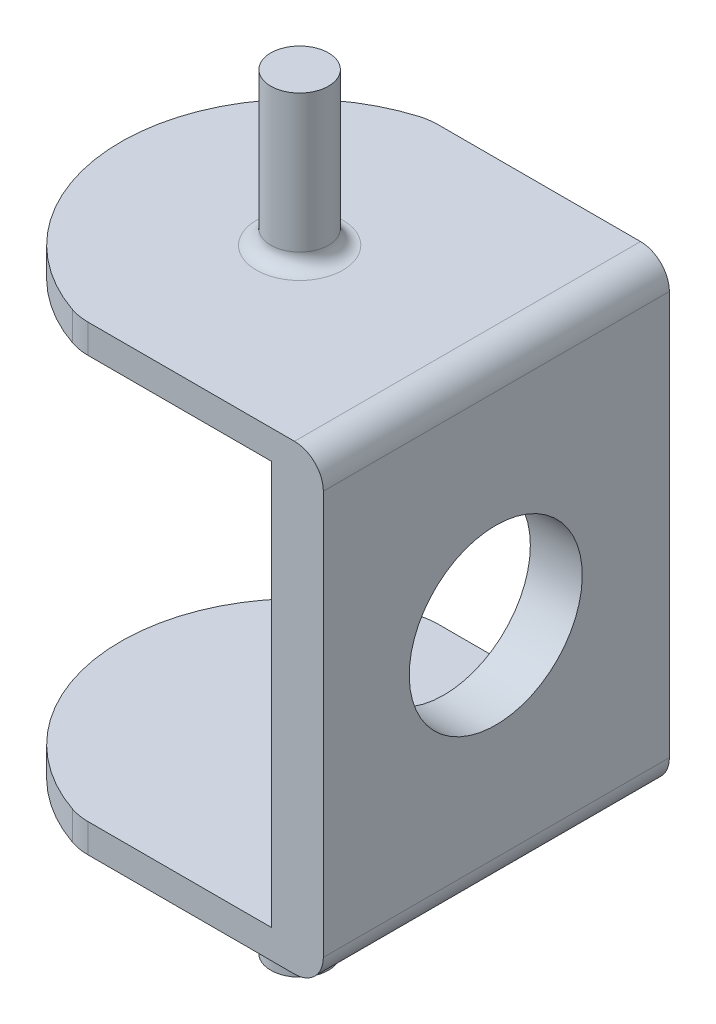
ISO-10303-21;
HEADER;
FILE_DESCRIPTION(('STEP AP214'),'2;1');
FILE_NAME('part.step','',(''),(''),'','','');
FILE_SCHEMA(('AUTOMOTIVE_DESIGN { 1 0 10303 214 1 1 1 1 }'));
ENDSEC;
DATA;
#1=APPLICATION_CONTEXT('core data for automotive mechanical design processes');
#2=APPLICATION_PROTOCOL_DEFINITION('international standard','automotive_design',2000,#1);
#3=PRODUCT_CONTEXT('',#1,'mechanical');
#4=PRODUCT('Part','Part','',(#3));
#5=PRODUCT_RELATED_PRODUCT_CATEGORY('part','',(#4));
#6=PRODUCT_DEFINITION_FORMATION('','',#4);
#7=PRODUCT_DEFINITION_CONTEXT('part definition',#1,'design');
#8=PRODUCT_DEFINITION('design','',#6,#7);
#9=PRODUCT_DEFINITION_SHAPE('','',#8);
#10=(LENGTH_UNIT() NAMED_UNIT(*) SI_UNIT(.MILLI.,.METRE.));
#11=(NAMED_UNIT(*) PLANE_ANGLE_UNIT() SI_UNIT($,.RADIAN.));
#12=(NAMED_UNIT(*) SI_UNIT($,.STERADIAN.) SOLID_ANGLE_UNIT());
#13=UNCERTAINTY_MEASURE_WITH_UNIT(LENGTH_MEASURE(1.E-05),#10,'distance_accuracy_value','');
#14=(GEOMETRIC_REPRESENTATION_CONTEXT(3) GLOBAL_UNCERTAINTY_ASSIGNED_CONTEXT((#13)) GLOBAL_UNIT_ASSIGNED_CONTEXT((#10,
#11,#12)) REPRESENTATION_CONTEXT('',''));
#15=CARTESIAN_POINT('',(0.,0.,0.));
#16=DIRECTION('',(0.,0.,1.));
#17=DIRECTION('',(1.,0.,0.));
#18=AXIS2_PLACEMENT_3D('',#15,#16,#17);
#19=CARTESIAN_POINT('',(60.,70.125,59.7864866616264));
#20=DIRECTION('',(0.,0.,1.));
#21=DIRECTION('',(1.,0.,0.));
#22=AXIS2_PLACEMENT_3D('',#19,#20,#21);
#23=PLANE('',#22);
#24=DIRECTION('',(1.,0.,0.));
#25=VECTOR('',#24,1.);
#26=CARTESIAN_POINT('',(60.,-79.875,59.7864866616264));
#27=LINE('',#26,#25);
#28=CARTESIAN_POINT('',(-13.5908207957896,-79.875,59.7864866616265));
#29=VERTEX_POINT('',#28);
#30=CARTESIAN_POINT('',(58.,-79.875,59.7864866616264));
#31=VERTEX_POINT('',#30);
#32=EDGE_CURVE('E192',#29,#31,#27,.T.);
#33=ORIENTED_EDGE('',*,*,#32,.T.);
#34=CARTESIAN_POINT('',(58.,-69.875,59.7864866616264));
#35=DIRECTION('',(0.,0.,1.));
#36=DIRECTION('',(1.,0.,0.));
#37=AXIS2_PLACEMENT_3D('',#34,#35,#36);
#38=CIRCLE('',#37,10.);
#39=CARTESIAN_POINT('',(68.,-69.875,59.7864866616265));
#40=VERTEX_POINT('',#39);
#41=EDGE_CURVE('E266',#31,#40,#38,.T.);
#42=ORIENTED_EDGE('',*,*,#41,.T.);
#43=DIRECTION('',(0.,1.,0.));
#44=VECTOR('',#43,1.);
#45=CARTESIAN_POINT('',(68.,-79.875,59.7864866616265));
#46=LINE('',#45,#44);
#47=CARTESIAN_POINT('',(68.,70.125,59.7864866616265));
#48=VERTEX_POINT('',#47);
#49=EDGE_CURVE('E172',#40,#48,#46,.T.);
#50=ORIENTED_EDGE('',*,*,#49,.T.);
#51=CARTESIAN_POINT('',(58.,70.125,59.7864866616264));
#52=DIRECTION('',(0.,0.,1.));
#53=DIRECTION('',(1.,0.,0.));
#54=AXIS2_PLACEMENT_3D('',#51,#52,#53);
#55=CIRCLE('',#54,10.);
#56=CARTESIAN_POINT('',(58.,80.125,59.7864866616264));
#57=VERTEX_POINT('',#56);
#58=EDGE_CURVE('E264',#48,#57,#55,.T.);
#59=ORIENTED_EDGE('',*,*,#58,.T.);
#60=DIRECTION('',(1.,0.,0.));
#61=VECTOR('',#60,1.);
#62=CARTESIAN_POINT('',(60.,80.125,59.7864866616264));
#63=LINE('',#62,#61);
#64=CARTESIAN_POINT('',(-13.5908207957896,80.125,59.7864866616265));
#65=VERTEX_POINT('',#64);
#66=EDGE_CURVE('E200',#65,#57,#63,.T.);
#67=ORIENTED_EDGE('',*,*,#66,.F.);
#68=DIRECTION('',(0.,1.,0.));
#69=VECTOR('',#68,1.);
#70=CARTESIAN_POINT('',(-13.5908207957896,70.125,59.7864866616265));
#71=LINE('',#70,#69);
#72=CARTESIAN_POINT('',(-13.5908207957896,70.125,59.7864866616265));
#73=VERTEX_POINT('',#72);
#74=EDGE_CURVE('E157',#65,#73,#71,.F.);
#75=ORIENTED_EDGE('',*,*,#74,.T.);
#76=DIRECTION('',(1.,0.,0.));
#77=VECTOR('',#76,1.);
#78=CARTESIAN_POINT('',(60.,70.125,59.7864866616264));
#79=LINE('',#78,#77);
#80=CARTESIAN_POINT('',(50.,70.125,59.7864866616265));
#81=VERTEX_POINT('',#80);
#82=EDGE_CURVE('E150',#73,#81,#79,.T.);
#83=ORIENTED_EDGE('',*,*,#82,.T.);
#84=DIRECTION('',(0.,-1.,0.));
#85=VECTOR('',#84,1.);
#86=CARTESIAN_POINT('',(50.,70.125,59.7864866616265));
#87=LINE('',#86,#85);
#88=CARTESIAN_POINT('',(50.,-69.875,59.7864866616264));
#89=VERTEX_POINT('',#88);
#90=EDGE_CURVE('E154',#81,#89,#87,.T.);
#91=ORIENTED_EDGE('',*,*,#90,.T.);
#92=DIRECTION('',(1.,0.,0.));
#93=VECTOR('',#92,1.);
#94=CARTESIAN_POINT('',(60.,-69.875,59.7864866616264));
#95=LINE('',#94,#93);
#96=CARTESIAN_POINT('',(-13.5908207957896,-69.875,59.7864866616265));
#97=VERTEX_POINT('',#96);
#98=EDGE_CURVE('E182',#97,#89,#95,.T.);
#99=ORIENTED_EDGE('',*,*,#98,.F.);
#100=DIRECTION('',(0.,1.,0.));
#101=VECTOR('',#100,1.);
#102=CARTESIAN_POINT('',(-13.5908207957896,-79.875,59.7864866616265));
#103=LINE('',#102,#101);
#104=EDGE_CURVE('E258',#97,#29,#103,.F.);
#105=ORIENTED_EDGE('',*,*,#104,.T.);
#106=EDGE_LOOP('',(#33,#42,#50,#59,#67,#75,#83,#91,#99,#105));
#107=FACE_BOUND('',#106,.T.);
#108=ADVANCED_FACE('F48',(#107),#23,.T.);
#109=CARTESIAN_POINT('',(0.,70.125,0.));
#110=DIRECTION('',(0.,1.,0.));
#111=DIRECTION('',(-1.,0.,0.));
#112=AXIS2_PLACEMENT_3D('',#109,#110,#111);
#113=CYLINDRICAL_SURFACE('',#112,62.0437264140448);
#114=CARTESIAN_POINT('',(0.,80.125,0.));
#115=DIRECTION('',(0.,1.,0.));
#116=DIRECTION('',(-1.,0.,0.));
#117=AXIS2_PLACEMENT_3D('',#114,#115,#116);
#118=CIRCLE('',#117,62.0437264140448);
#119=CARTESIAN_POINT('',(-18.106502363727,80.125,-59.3428897130329));
#120=VERTEX_POINT('',#119);
#121=CARTESIAN_POINT('',(-20.0559093856771,80.125,58.7127284841571));
#122=VERTEX_POINT('',#121);
#123=EDGE_CURVE('E204',#120,#122,#118,.T.);
#124=ORIENTED_EDGE('',*,*,#123,.F.);
#125=DIRECTION('',(0.,1.,0.));
#126=VECTOR('',#125,1.);
#127=CARTESIAN_POINT('',(-18.106502363727,70.125,-59.3428897130329));
#128=LINE('',#127,#126);
#129=CARTESIAN_POINT('',(-18.106502363727,70.125,-59.3428897130329));
#130=VERTEX_POINT('',#129);
#131=EDGE_CURVE('E237',#120,#130,#128,.F.);
#132=ORIENTED_EDGE('',*,*,#131,.T.);
#133=CARTESIAN_POINT('',(0.,70.125,0.));
#134=DIRECTION('',(0.,1.,0.));
#135=DIRECTION('',(-1.,0.,0.));
#136=AXIS2_PLACEMENT_3D('',#133,#134,#135);
#137=CIRCLE('',#136,62.0437264140448);
#138=CARTESIAN_POINT('',(-20.0559093856771,70.125,58.7127284841571));
#139=VERTEX_POINT('',#138);
#140=EDGE_CURVE('E162',#130,#139,#137,.T.);
#141=ORIENTED_EDGE('',*,*,#140,.T.);
#142=DIRECTION('',(0.,1.,0.));
#143=VECTOR('',#142,1.);
#144=CARTESIAN_POINT('',(-20.0559093856771,70.125,58.7127284841571));
#145=LINE('',#144,#143);
#146=EDGE_CURVE('E234',#139,#122,#145,.T.);
#147=ORIENTED_EDGE('',*,*,#146,.T.);
#148=EDGE_LOOP('',(#124,#132,#141,#147));
#149=FACE_BOUND('',#148,.T.);
#150=ADVANCED_FACE('F317',(#149),#113,.T.);
#151=CARTESIAN_POINT('',(60.,70.125,-60.2135133383735));
#152=DIRECTION('',(0.,0.,-1.));
#153=DIRECTION('',(-1.,0.,0.));
#154=AXIS2_PLACEMENT_3D('',#151,#152,#153);
#155=PLANE('',#154);
#156=DIRECTION('',(0.,-1.,0.));
#157=VECTOR('',#156,1.);
#158=CARTESIAN_POINT('',(68.,-79.875,-60.2135133383735));
#159=LINE('',#158,#157);
#160=CARTESIAN_POINT('',(68.,70.125,-60.2135133383735));
#161=VERTEX_POINT('',#160);
#162=CARTESIAN_POINT('',(68.,-69.875,-60.2135133383735));
#163=VERTEX_POINT('',#162);
#164=EDGE_CURVE('E179',#161,#163,#159,.T.);
#165=ORIENTED_EDGE('',*,*,#164,.T.);
#166=CARTESIAN_POINT('',(58.,-69.875,-60.2135133383735));
#167=DIRECTION('',(0.,0.,-1.));
#168=DIRECTION('',(-1.,0.,0.));
#169=AXIS2_PLACEMENT_3D('',#166,#167,#168);
#170=CIRCLE('',#169,10.);
#171=CARTESIAN_POINT('',(58.,-79.875,-60.2135133383735));
#172=VERTEX_POINT('',#171);
#173=EDGE_CURVE('E56',#163,#172,#170,.T.);
#174=ORIENTED_EDGE('',*,*,#173,.T.);
#175=DIRECTION('',(-1.,0.,0.));
#176=VECTOR('',#175,1.);
#177=CARTESIAN_POINT('',(60.,-79.875,-60.2135133383735));
#178=LINE('',#177,#176);
#179=CARTESIAN_POINT('',(-12.2698115618579,-79.875,-60.2135133383735));
#180=VERTEX_POINT('',#179);
#181=EDGE_CURVE('E185',#172,#180,#178,.T.);
#182=ORIENTED_EDGE('',*,*,#181,.T.);
#183=DIRECTION('',(0.,1.,0.));
#184=VECTOR('',#183,1.);
#185=CARTESIAN_POINT('',(-12.2698115618579,-69.875,-60.2135133383735));
#186=LINE('',#185,#184);
#187=CARTESIAN_POINT('',(-12.2698115618579,-69.875,-60.2135133383735));
#188=VERTEX_POINT('',#187);
#189=EDGE_CURVE('E225',#180,#188,#186,.T.);
#190=ORIENTED_EDGE('',*,*,#189,.T.);
#191=DIRECTION('',(-1.,0.,0.));
#192=VECTOR('',#191,1.);
#193=CARTESIAN_POINT('',(60.,-69.875,-60.2135133383735));
#194=LINE('',#193,#192);
#195=CARTESIAN_POINT('',(50.,-69.875,-60.2135133383735));
#196=VERTEX_POINT('',#195);
#197=EDGE_CURVE('E188',#196,#188,#194,.T.);
#198=ORIENTED_EDGE('',*,*,#197,.F.);
#199=DIRECTION('',(0.,1.,0.));
#200=VECTOR('',#199,1.);
#201=CARTESIAN_POINT('',(50.,70.125,-60.2135133383735));
#202=LINE('',#201,#200);
#203=CARTESIAN_POINT('',(50.,70.125,-60.2135133383735));
#204=VERTEX_POINT('',#203);
#205=EDGE_CURVE('E195',#196,#204,#202,.T.);
#206=ORIENTED_EDGE('',*,*,#205,.T.);
#207=DIRECTION('',(-1.,0.,0.));
#208=VECTOR('',#207,1.);
#209=CARTESIAN_POINT('',(60.,70.125,-60.2135133383735));
#210=LINE('',#209,#208);
#211=CARTESIAN_POINT('',(-12.2698115618579,70.125,-60.2135133383735));
#212=VERTEX_POINT('',#211);
#213=EDGE_CURVE('E177',#204,#212,#210,.T.);
#214=ORIENTED_EDGE('',*,*,#213,.T.);
#215=DIRECTION('',(0.,1.,0.));
#216=VECTOR('',#215,1.);
#217=CARTESIAN_POINT('',(-12.2698115618579,70.125,-60.2135133383735));
#218=LINE('',#217,#216);
#219=CARTESIAN_POINT('',(-12.2698115618579,80.125,-60.2135133383735));
#220=VERTEX_POINT('',#219);
#221=EDGE_CURVE('E227',#212,#220,#218,.T.);
#222=ORIENTED_EDGE('',*,*,#221,.T.);
#223=DIRECTION('',(-1.,0.,0.));
#224=VECTOR('',#223,1.);
#225=CARTESIAN_POINT('',(60.,80.125,-60.2135133383735));
#226=LINE('',#225,#224);
#227=CARTESIAN_POINT('',(58.,80.125,-60.2135133383735));
#228=VERTEX_POINT('',#227);
#229=EDGE_CURVE('E191',#228,#220,#226,.T.);
#230=ORIENTED_EDGE('',*,*,#229,.F.);
#231=CARTESIAN_POINT('',(58.,70.125,-60.2135133383735));
#232=DIRECTION('',(0.,0.,-1.));
#233=DIRECTION('',(-1.,0.,0.));
#234=AXIS2_PLACEMENT_3D('',#231,#232,#233);
#235=CIRCLE('',#234,10.);
#236=EDGE_CURVE('E272',#228,#161,#235,.T.);
#237=ORIENTED_EDGE('',*,*,#236,.T.);
#238=EDGE_LOOP('',(#165,#174,#182,#190,#198,#206,#214,#222,#230,#237));
#239=FACE_BOUND('',#238,.T.);
#240=ADVANCED_FACE('F276',(#239),#155,.T.);
#241=CARTESIAN_POINT('',(0.,70.125,0.));
#242=DIRECTION('',(0.,1.,0.));
#243=DIRECTION('',(-1.,0.,0.));
#244=AXIS2_PLACEMENT_3D('',#241,#242,#243);
#245=PLANE('',#244);
#246=ORIENTED_EDGE('',*,*,#140,.F.);
#247=CARTESIAN_POINT('',(-12.2698115618579,70.125,-40.2135133383735));
#248=DIRECTION('',(0.,1.,0.));
#249=DIRECTION('',(-1.,0.,0.));
#250=AXIS2_PLACEMENT_3D('',#247,#248,#249);
#251=CIRCLE('',#250,20.);
#252=EDGE_CURVE('E241',#130,#212,#251,.F.);
#253=ORIENTED_EDGE('',*,*,#252,.T.);
#254=ORIENTED_EDGE('',*,*,#213,.F.);
#255=DIRECTION('',(0.,0.,1.));
#256=VECTOR('',#255,1.);
#257=CARTESIAN_POINT('',(50.,70.125,-221.222829839003));
#258=LINE('',#257,#256);
#259=EDGE_CURVE('E169',#204,#81,#258,.T.);
#260=ORIENTED_EDGE('',*,*,#259,.T.);
#261=ORIENTED_EDGE('',*,*,#82,.F.);
#262=CARTESIAN_POINT('',(-13.5908207957896,70.125,39.7864866616265));
#263=DIRECTION('',(0.,1.,0.));
#264=DIRECTION('',(-1.,0.,0.));
#265=AXIS2_PLACEMENT_3D('',#262,#263,#264);
#266=CIRCLE('',#265,20.);
#267=EDGE_CURVE('E239',#73,#139,#266,.F.);
#268=ORIENTED_EDGE('',*,*,#267,.T.);
#269=EDGE_LOOP('',(#246,#253,#254,#260,#261,#268));
#270=FACE_BOUND('',#269,.T.);
#271=ADVANCED_FACE('F175',(#270),#245,.F.);
#272=CARTESIAN_POINT('',(0.,80.125,0.));
#273=DIRECTION('',(0.,1.,0.));
#274=DIRECTION('',(-1.,0.,0.));
#275=AXIS2_PLACEMENT_3D('',#272,#273,#274);
#276=PLANE('',#275);
#277=CARTESIAN_POINT('',(0.,80.125,0.));
#278=DIRECTION('',(0.,1.,0.));
#279=DIRECTION('',(-1.,0.,0.));
#280=AXIS2_PLACEMENT_3D('',#277,#278,#279);
#281=CIRCLE('',#280,15.);
#282=CARTESIAN_POINT('',(-15.,80.125,0.));
#283=VERTEX_POINT('',#282);
#284=EDGE_CURVE('E219',#283,#283,#281,.F.);
#285=ORIENTED_EDGE('',*,*,#284,.T.);
#286=EDGE_LOOP('',(#285));
#287=FACE_BOUND('',#286,.T.);
#288=ORIENTED_EDGE('',*,*,#66,.T.);
#289=DIRECTION('',(0.,0.,1.));
#290=VECTOR('',#289,1.);
#291=CARTESIAN_POINT('',(58.,80.125,0.));
#292=LINE('',#291,#290);
#293=EDGE_CURVE('E12',#57,#228,#292,.F.);
#294=ORIENTED_EDGE('',*,*,#293,.T.);
#295=ORIENTED_EDGE('',*,*,#229,.T.);
#296=CARTESIAN_POINT('',(-12.2698115618579,80.125,-40.2135133383735));
#297=DIRECTION('',(0.,1.,0.));
#298=DIRECTION('',(-1.,0.,0.));
#299=AXIS2_PLACEMENT_3D('',#296,#297,#298);
#300=CIRCLE('',#299,20.);
#301=EDGE_CURVE('E232',#220,#120,#300,.T.);
#302=ORIENTED_EDGE('',*,*,#301,.T.);
#303=ORIENTED_EDGE('',*,*,#123,.T.);
#304=CARTESIAN_POINT('',(-13.5908207957896,80.125,39.7864866616265));
#305=DIRECTION('',(0.,1.,0.));
#306=DIRECTION('',(-1.,0.,0.));
#307=AXIS2_PLACEMENT_3D('',#304,#305,#306);
#308=CIRCLE('',#307,20.);
#309=EDGE_CURVE('E230',#122,#65,#308,.T.);
#310=ORIENTED_EDGE('',*,*,#309,.T.);
#311=EDGE_LOOP('',(#288,#294,#295,#302,#303,#310));
#312=FACE_BOUND('',#311,.T.);
#313=ADVANCED_FACE('F325',(#287,#312),#276,.T.);
#314=CARTESIAN_POINT('',(0.,132.890900072,0.));
#315=DIRECTION('',(0.,1.,0.));
#316=DIRECTION('',(-1.,0.,0.));
#317=AXIS2_PLACEMENT_3D('',#314,#315,#316);
#318=PLANE('',#317);
#319=CARTESIAN_POINT('',(0.,132.890900072,0.));
#320=DIRECTION('',(0.,1.,0.));
#321=DIRECTION('',(-1.,0.,0.));
#322=AXIS2_PLACEMENT_3D('',#319,#320,#321);
#323=CIRCLE('',#322,10.);
#324=CARTESIAN_POINT('',(-9.99999999999997,132.890900072,0.));
#325=VERTEX_POINT('',#324);
#326=EDGE_CURVE('E161',#325,#325,#323,.T.);
#327=ORIENTED_EDGE('',*,*,#326,.T.);
#328=EDGE_LOOP('',(#327));
#329=FACE_BOUND('',#328,.T.);
#330=ADVANCED_FACE('F330',(#329),#318,.T.);
#331=CARTESIAN_POINT('',(0.,132.640900072,0.));
#332=DIRECTION('',(0.,-1.,0.));
#333=DIRECTION('',(1.,0.,0.));
#334=AXIS2_PLACEMENT_3D('',#331,#332,#333);
#335=CYLINDRICAL_SURFACE('',#334,10.);
#336=CARTESIAN_POINT('',(0.,85.125,0.));
#337=DIRECTION('',(0.,1.,0.));
#338=DIRECTION('',(-1.,0.,0.));
#339=AXIS2_PLACEMENT_3D('',#336,#337,#338);
#340=CIRCLE('',#339,10.);
#341=CARTESIAN_POINT('',(-9.99999999999997,85.125,0.));
#342=VERTEX_POINT('',#341);
#343=EDGE_CURVE('E222',#342,#342,#340,.T.);
#344=ORIENTED_EDGE('',*,*,#343,.T.);
#345=EDGE_LOOP('',(#344));
#346=FACE_BOUND('',#345,.T.);
#347=ORIENTED_EDGE('',*,*,#326,.F.);
#348=EDGE_LOOP('',(#347));
#349=FACE_BOUND('',#348,.T.);
#350=ADVANCED_FACE('F333',(#346,#349),#335,.T.);
#351=CARTESIAN_POINT('',(0.,-69.875,0.));
#352=DIRECTION('',(0.,-1.,0.));
#353=DIRECTION('',(1.,0.,0.));
#354=AXIS2_PLACEMENT_3D('',#351,#352,#353);
#355=CYLINDRICAL_SURFACE('',#354,62.0437264140448);
#356=CARTESIAN_POINT('',(0.,-69.875,0.));
#357=DIRECTION('',(0.,1.,0.));
#358=DIRECTION('',(-1.,0.,0.));
#359=AXIS2_PLACEMENT_3D('',#356,#357,#358);
#360=CIRCLE('',#359,62.0437264140448);
#361=CARTESIAN_POINT('',(-18.106502363727,-69.875,-59.3428897130329));
#362=VERTEX_POINT('',#361);
#363=CARTESIAN_POINT('',(-20.0559093856771,-69.875,58.7127284841571));
#364=VERTEX_POINT('',#363);
#365=EDGE_CURVE('E184',#362,#364,#360,.T.);
#366=ORIENTED_EDGE('',*,*,#365,.F.);
#367=DIRECTION('',(0.,-1.,0.));
#368=VECTOR('',#367,1.);
#369=CARTESIAN_POINT('',(-18.106502363727,-69.875,-59.3428897130329));
#370=LINE('',#369,#368);
#371=CARTESIAN_POINT('',(-18.106502363727,-79.875,-59.3428897130329));
#372=VERTEX_POINT('',#371);
#373=EDGE_CURVE('E245',#362,#372,#370,.T.);
#374=ORIENTED_EDGE('',*,*,#373,.T.);
#375=CARTESIAN_POINT('',(0.,-79.875,0.));
#376=DIRECTION('',(0.,1.,0.));
#377=DIRECTION('',(-1.,0.,0.));
#378=AXIS2_PLACEMENT_3D('',#375,#376,#377);
#379=CIRCLE('',#378,62.0437264140448);
#380=CARTESIAN_POINT('',(-20.0559093856771,-79.875,58.7127284841571));
#381=VERTEX_POINT('',#380);
#382=EDGE_CURVE('E194',#372,#381,#379,.T.);
#383=ORIENTED_EDGE('',*,*,#382,.T.);
#384=DIRECTION('',(0.,-1.,0.));
#385=VECTOR('',#384,1.);
#386=CARTESIAN_POINT('',(-20.0559093856771,-69.875,58.7127284841571));
#387=LINE('',#386,#385);
#388=EDGE_CURVE('E243',#381,#364,#387,.F.);
#389=ORIENTED_EDGE('',*,*,#388,.T.);
#390=EDGE_LOOP('',(#366,#374,#383,#389));
#391=FACE_BOUND('',#390,.T.);
#392=ADVANCED_FACE('F337',(#391),#355,.T.);
#393=CARTESIAN_POINT('',(0.,-69.875,0.));
#394=DIRECTION('',(0.,-1.,0.));
#395=DIRECTION('',(-1.,0.,0.));
#396=AXIS2_PLACEMENT_3D('',#393,#394,#395);
#397=PLANE('',#396);
#398=ORIENTED_EDGE('',*,*,#197,.T.);
#399=CARTESIAN_POINT('',(-12.2698115618579,-69.875,-40.2135133383735));
#400=DIRECTION('',(0.,-1.,0.));
#401=DIRECTION('',(1.,0.,0.));
#402=AXIS2_PLACEMENT_3D('',#399,#400,#401);
#403=CIRCLE('',#402,20.);
#404=EDGE_CURVE('E255',#188,#362,#403,.F.);
#405=ORIENTED_EDGE('',*,*,#404,.T.);
#406=ORIENTED_EDGE('',*,*,#365,.T.);
#407=CARTESIAN_POINT('',(-13.5908207957896,-69.875,39.7864866616265));
#408=DIRECTION('',(0.,-1.,0.));
#409=DIRECTION('',(1.,0.,0.));
#410=AXIS2_PLACEMENT_3D('',#407,#408,#409);
#411=CIRCLE('',#410,20.);
#412=EDGE_CURVE('E253',#364,#97,#411,.F.);
#413=ORIENTED_EDGE('',*,*,#412,.T.);
#414=ORIENTED_EDGE('',*,*,#98,.T.);
#415=DIRECTION('',(0.,0.,1.));
#416=VECTOR('',#415,1.);
#417=CARTESIAN_POINT('',(50.,-69.875,-221.222829839003));
#418=LINE('',#417,#416);
#419=EDGE_CURVE('E171',#196,#89,#418,.T.);
#420=ORIENTED_EDGE('',*,*,#419,.F.);
#421=EDGE_LOOP('',(#398,#405,#406,#413,#414,#420));
#422=FACE_BOUND('',#421,.T.);
#423=ADVANCED_FACE('F380',(#422),#397,.F.);
#424=CARTESIAN_POINT('',(0.,-79.875,0.));
#425=DIRECTION('',(0.,-1.,0.));
#426=DIRECTION('',(-1.,0.,0.));
#427=AXIS2_PLACEMENT_3D('',#424,#425,#426);
#428=PLANE('',#427);
#429=CARTESIAN_POINT('',(0.,-79.875,0.));
#430=DIRECTION('',(0.,-1.,0.));
#431=DIRECTION('',(1.,0.,0.));
#432=AXIS2_PLACEMENT_3D('',#429,#430,#431);
#433=CIRCLE('',#432,15.);
#434=CARTESIAN_POINT('',(15.,-79.875,0.));
#435=VERTEX_POINT('',#434);
#436=EDGE_CURVE('E213',#435,#435,#433,.F.);
#437=ORIENTED_EDGE('',*,*,#436,.T.);
#438=EDGE_LOOP('',(#437));
#439=FACE_BOUND('',#438,.T.);
#440=ORIENTED_EDGE('',*,*,#181,.F.);
#441=DIRECTION('',(0.,0.,1.));
#442=VECTOR('',#441,1.);
#443=CARTESIAN_POINT('',(58.,-79.875,0.));
#444=LINE('',#443,#442);
#445=EDGE_CURVE('E261',#172,#31,#444,.T.);
#446=ORIENTED_EDGE('',*,*,#445,.T.);
#447=ORIENTED_EDGE('',*,*,#32,.F.);
#448=CARTESIAN_POINT('',(-13.5908207957896,-79.875,39.7864866616265));
#449=DIRECTION('',(0.,-1.,0.));
#450=DIRECTION('',(1.,0.,0.));
#451=AXIS2_PLACEMENT_3D('',#448,#449,#450);
#452=CIRCLE('',#451,20.);
#453=EDGE_CURVE('E248',#29,#381,#452,.T.);
#454=ORIENTED_EDGE('',*,*,#453,.T.);
#455=ORIENTED_EDGE('',*,*,#382,.F.);
#456=CARTESIAN_POINT('',(-12.2698115618579,-79.875,-40.2135133383735));
#457=DIRECTION('',(0.,-1.,0.));
#458=DIRECTION('',(1.,0.,0.));
#459=AXIS2_PLACEMENT_3D('',#456,#457,#458);
#460=CIRCLE('',#459,20.);
#461=EDGE_CURVE('E250',#372,#180,#460,.T.);
#462=ORIENTED_EDGE('',*,*,#461,.T.);
#463=EDGE_LOOP('',(#440,#446,#447,#454,#455,#462));
#464=FACE_BOUND('',#463,.T.);
#465=ADVANCED_FACE('F280',(#439,#464),#428,.T.);
#466=CARTESIAN_POINT('',(0.,-132.640900072,0.));
#467=DIRECTION('',(0.,-1.,0.));
#468=DIRECTION('',(1.,0.,0.));
#469=AXIS2_PLACEMENT_3D('',#466,#467,#468);
#470=PLANE('',#469);
#471=CARTESIAN_POINT('',(0.,-132.640900072,0.));
#472=DIRECTION('',(0.,-1.,0.));
#473=DIRECTION('',(1.,0.,0.));
#474=AXIS2_PLACEMENT_3D('',#471,#472,#473);
#475=CIRCLE('',#474,10.);
#476=CARTESIAN_POINT('',(10.,-132.640900072,0.));
#477=VERTEX_POINT('',#476);
#478=EDGE_CURVE('E210',#477,#477,#475,.T.);
#479=ORIENTED_EDGE('',*,*,#478,.T.);
#480=EDGE_LOOP('',(#479));
#481=FACE_BOUND('',#480,.T.);
#482=ADVANCED_FACE('F339',(#481),#470,.T.);
#483=CARTESIAN_POINT('',(0.,-84.875,0.));
#484=DIRECTION('',(0.,-1.,0.));
#485=DIRECTION('',(1.,0.,0.));
#486=AXIS2_PLACEMENT_3D('',#483,#484,#485);
#487=CIRCLE('',#486,10.);
#488=CARTESIAN_POINT('',(10.,-84.875,0.));
#489=VERTEX_POINT('',#488);
#490=EDGE_CURVE('E216',#489,#489,#487,.T.);
#491=ORIENTED_EDGE('',*,*,#490,.T.);
#492=EDGE_LOOP('',(#491));
#493=FACE_BOUND('',#492,.T.);
#494=ORIENTED_EDGE('',*,*,#478,.F.);
#495=EDGE_LOOP('',(#494));
#496=FACE_BOUND('',#495,.T.);
#497=ADVANCED_FACE('F312',(#493,#496),#335,.T.);
#498=CARTESIAN_POINT('',(50.,70.125,-221.222829839003));
#499=DIRECTION('',(-1.,0.,0.));
#500=DIRECTION('',(0.,-1.,0.));
#501=AXIS2_PLACEMENT_3D('',#498,#499,#500);
#502=PLANE('',#501);
#503=CARTESIAN_POINT('',(50.,0.,0.));
#504=DIRECTION('',(-1.,0.,0.));
#505=DIRECTION('',(0.,-1.,0.));
#506=AXIS2_PLACEMENT_3D('',#503,#504,#505);
#507=CIRCLE('',#506,30.);
#508=CARTESIAN_POINT('',(50.,-30.,0.));
#509=VERTEX_POINT('',#508);
#510=EDGE_CURVE('E288',#509,#509,#507,.F.);
#511=ORIENTED_EDGE('',*,*,#510,.T.);
#512=EDGE_LOOP('',(#511));
#513=FACE_BOUND('',#512,.T.);
#514=ORIENTED_EDGE('',*,*,#205,.F.);
#515=ORIENTED_EDGE('',*,*,#419,.T.);
#516=ORIENTED_EDGE('',*,*,#90,.F.);
#517=ORIENTED_EDGE('',*,*,#259,.F.);
#518=EDGE_LOOP('',(#514,#515,#516,#517));
#519=FACE_BOUND('',#518,.T.);
#520=ADVANCED_FACE('F168',(#513,#519),#502,.T.);
#521=CARTESIAN_POINT('',(68.,-79.875,-221.222829839003));
#522=DIRECTION('',(1.,0.,0.));
#523=DIRECTION('',(0.,0.,-1.));
#524=AXIS2_PLACEMENT_3D('',#521,#522,#523);
#525=PLANE('',#524);
#526=CARTESIAN_POINT('',(68.,0.,0.));
#527=DIRECTION('',(1.,0.,0.));
#528=DIRECTION('',(0.,1.,0.));
#529=AXIS2_PLACEMENT_3D('',#526,#527,#528);
#530=CIRCLE('',#529,30.);
#531=CARTESIAN_POINT('',(68.,30.,0.));
#532=VERTEX_POINT('',#531);
#533=EDGE_CURVE('E291',#532,#532,#530,.T.);
#534=ORIENTED_EDGE('',*,*,#533,.F.);
#535=EDGE_LOOP('',(#534));
#536=FACE_BOUND('',#535,.T.);
#537=ORIENTED_EDGE('',*,*,#49,.F.);
#538=DIRECTION('',(0.,0.,1.));
#539=VECTOR('',#538,1.);
#540=CARTESIAN_POINT('',(68.,-69.875,-221.222829839003));
#541=LINE('',#540,#539);
#542=EDGE_CURVE('E69',#40,#163,#541,.F.);
#543=ORIENTED_EDGE('',*,*,#542,.T.);
#544=ORIENTED_EDGE('',*,*,#164,.F.);
#545=DIRECTION('',(0.,0.,1.));
#546=VECTOR('',#545,1.);
#547=CARTESIAN_POINT('',(68.,70.125,-221.222829839003));
#548=LINE('',#547,#546);
#549=EDGE_CURVE('E268',#161,#48,#548,.T.);
#550=ORIENTED_EDGE('',*,*,#549,.T.);
#551=EDGE_LOOP('',(#537,#543,#544,#550));
#552=FACE_BOUND('',#551,.T.);
#553=ADVANCED_FACE('F286',(#536,#552),#525,.T.);
#554=CARTESIAN_POINT('',(0.,-84.875,0.));
#555=DIRECTION('',(0.,-1.,0.));
#556=DIRECTION('',(1.,0.,0.));
#557=AXIS2_PLACEMENT_3D('',#554,#555,#556);
#558=TOROIDAL_SURFACE('',#557,15.,5.);
#559=ORIENTED_EDGE('',*,*,#490,.F.);
#560=EDGE_LOOP('',(#559));
#561=FACE_BOUND('',#560,.T.);
#562=ORIENTED_EDGE('',*,*,#436,.F.);
#563=EDGE_LOOP('',(#562));
#564=FACE_BOUND('',#563,.T.);
#565=ADVANCED_FACE('F303',(#561,#564),#558,.F.);
#566=CARTESIAN_POINT('',(0.,85.125,0.));
#567=DIRECTION('',(0.,1.,0.));
#568=DIRECTION('',(-1.,0.,0.));
#569=AXIS2_PLACEMENT_3D('',#566,#567,#568);
#570=TOROIDAL_SURFACE('',#569,15.,5.);
#571=ORIENTED_EDGE('',*,*,#343,.F.);
#572=EDGE_LOOP('',(#571));
#573=FACE_BOUND('',#572,.T.);
#574=ORIENTED_EDGE('',*,*,#284,.F.);
#575=EDGE_LOOP('',(#574));
#576=FACE_BOUND('',#575,.T.);
#577=ADVANCED_FACE('F309',(#573,#576),#570,.F.);
#578=CARTESIAN_POINT('',(-12.2698115618579,70.125,-40.2135133383735));
#579=DIRECTION('',(0.,1.,0.));
#580=DIRECTION('',(-1.,0.,0.));
#581=AXIS2_PLACEMENT_3D('',#578,#579,#580);
#582=CYLINDRICAL_SURFACE('',#581,20.);
#583=ORIENTED_EDGE('',*,*,#252,.F.);
#584=ORIENTED_EDGE('',*,*,#131,.F.);
#585=ORIENTED_EDGE('',*,*,#301,.F.);
#586=ORIENTED_EDGE('',*,*,#221,.F.);
#587=EDGE_LOOP('',(#583,#584,#585,#586));
#588=FACE_BOUND('',#587,.T.);
#589=ADVANCED_FACE('F345',(#588),#582,.T.);
#590=CARTESIAN_POINT('',(-12.2698115618579,-69.875,-40.2135133383735));
#591=DIRECTION('',(0.,-1.,0.));
#592=DIRECTION('',(1.,0.,0.));
#593=AXIS2_PLACEMENT_3D('',#590,#591,#592);
#594=CYLINDRICAL_SURFACE('',#593,20.);
#595=ORIENTED_EDGE('',*,*,#404,.F.);
#596=ORIENTED_EDGE('',*,*,#189,.F.);
#597=ORIENTED_EDGE('',*,*,#461,.F.);
#598=ORIENTED_EDGE('',*,*,#373,.F.);
#599=EDGE_LOOP('',(#595,#596,#597,#598));
#600=FACE_BOUND('',#599,.T.);
#601=ADVANCED_FACE('F349',(#600),#594,.T.);
#602=CARTESIAN_POINT('',(-13.5908207957896,-69.875,39.7864866616265));
#603=DIRECTION('',(0.,-1.,0.));
#604=DIRECTION('',(1.,0.,0.));
#605=AXIS2_PLACEMENT_3D('',#602,#603,#604);
#606=CYLINDRICAL_SURFACE('',#605,20.);
#607=ORIENTED_EDGE('',*,*,#412,.F.);
#608=ORIENTED_EDGE('',*,*,#388,.F.);
#609=ORIENTED_EDGE('',*,*,#453,.F.);
#610=ORIENTED_EDGE('',*,*,#104,.F.);
#611=EDGE_LOOP('',(#607,#608,#609,#610));
#612=FACE_BOUND('',#611,.T.);
#613=ADVANCED_FACE('F353',(#612),#606,.T.);
#614=CARTESIAN_POINT('',(-13.5908207957896,70.125,39.7864866616265));
#615=DIRECTION('',(0.,1.,0.));
#616=DIRECTION('',(-1.,0.,0.));
#617=AXIS2_PLACEMENT_3D('',#614,#615,#616);
#618=CYLINDRICAL_SURFACE('',#617,20.);
#619=ORIENTED_EDGE('',*,*,#267,.F.);
#620=ORIENTED_EDGE('',*,*,#74,.F.);
#621=ORIENTED_EDGE('',*,*,#309,.F.);
#622=ORIENTED_EDGE('',*,*,#146,.F.);
#623=EDGE_LOOP('',(#619,#620,#621,#622));
#624=FACE_BOUND('',#623,.T.);
#625=ADVANCED_FACE('F357',(#624),#618,.T.);
#626=CARTESIAN_POINT('',(58.,-69.875,0.));
#627=DIRECTION('',(0.,0.,1.));
#628=DIRECTION('',(1.,0.,0.));
#629=AXIS2_PLACEMENT_3D('',#626,#627,#628);
#630=CYLINDRICAL_SURFACE('',#629,10.);
#631=ORIENTED_EDGE('',*,*,#173,.F.);
#632=ORIENTED_EDGE('',*,*,#542,.F.);
#633=ORIENTED_EDGE('',*,*,#41,.F.);
#634=ORIENTED_EDGE('',*,*,#445,.F.);
#635=EDGE_LOOP('',(#631,#632,#633,#634));
#636=FACE_BOUND('',#635,.T.);
#637=ADVANCED_FACE('F284',(#636),#630,.T.);
#638=CARTESIAN_POINT('',(58.,70.125,-221.222829839003));
#639=DIRECTION('',(0.,0.,1.));
#640=DIRECTION('',(1.,0.,0.));
#641=AXIS2_PLACEMENT_3D('',#638,#639,#640);
#642=CYLINDRICAL_SURFACE('',#641,10.);
#643=ORIENTED_EDGE('',*,*,#236,.F.);
#644=ORIENTED_EDGE('',*,*,#293,.F.);
#645=ORIENTED_EDGE('',*,*,#58,.F.);
#646=ORIENTED_EDGE('',*,*,#549,.F.);
#647=EDGE_LOOP('',(#643,#644,#645,#646));
#648=FACE_BOUND('',#647,.T.);
#649=ADVANCED_FACE('F50',(#648),#642,.T.);
#650=CARTESIAN_POINT('',(-34.8528137423857,0.,0.));
#651=DIRECTION('',(1.,0.,0.));
#652=DIRECTION('',(0.,1.,0.));
#653=AXIS2_PLACEMENT_3D('',#650,#651,#652);
#654=CYLINDRICAL_SURFACE('',#653,30.);
#655=ORIENTED_EDGE('',*,*,#533,.T.);
#656=EDGE_LOOP('',(#655));
#657=FACE_BOUND('',#656,.T.);
#658=ORIENTED_EDGE('',*,*,#510,.F.);
#659=EDGE_LOOP('',(#658));
#660=FACE_BOUND('',#659,.T.);
#661=ADVANCED_FACE('F299',(#657,#660),#654,.F.);
#662=CLOSED_SHELL('',(#108,#150,#240,#271,#313,#330,#350,#392,#423,#465,#482,#497,#520,#553,
#565,#577,#589,#601,#613,#625,#637,#649,#661));
#663=MANIFOLD_SOLID_BREP('B2',#662);
#664=ADVANCED_BREP_SHAPE_REPRESENTATION('',(#18,#663),#14);
#665=SHAPE_DEFINITION_REPRESENTATION(#9,#664);
ENDSEC;
END-ISO-10303-21;
